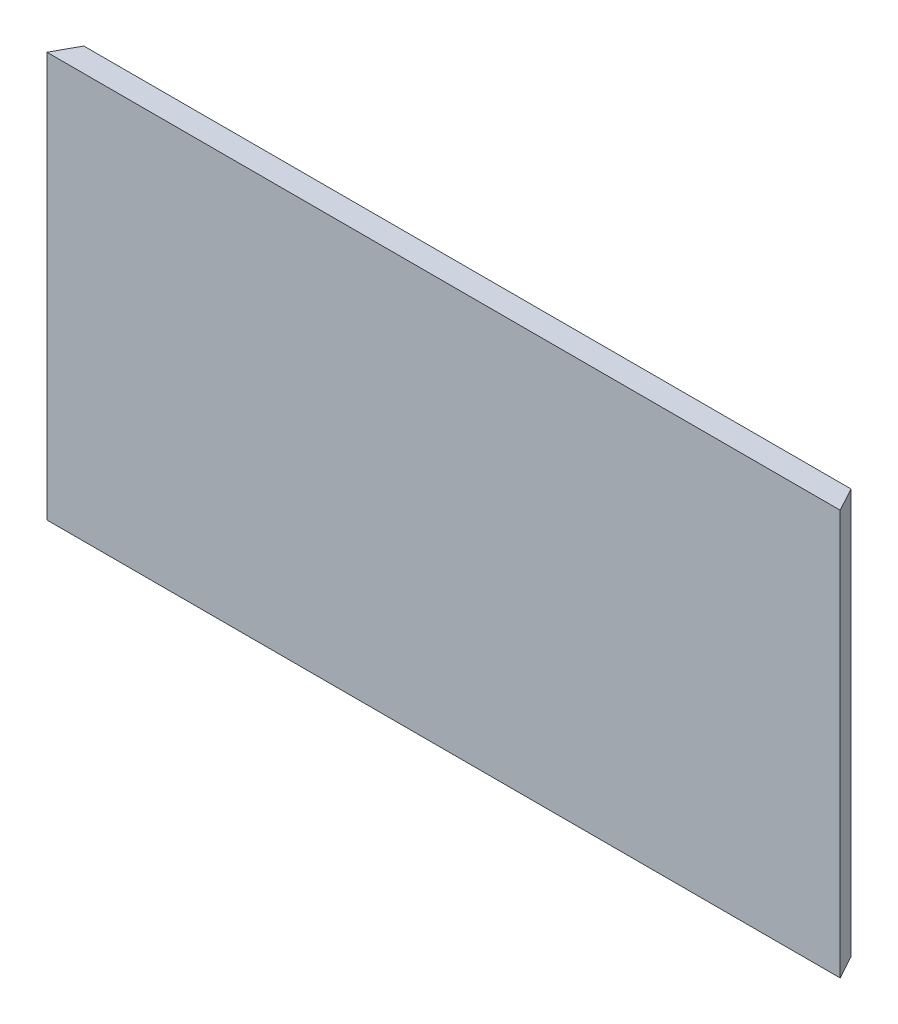
ISO-10303-21;
HEADER;
FILE_DESCRIPTION(('STEP AP214'),'2;1');
FILE_NAME('part.step','',(''),(''),'','','');
FILE_SCHEMA(('AUTOMOTIVE_DESIGN { 1 0 10303 214 1 1 1 1 }'));
ENDSEC;
DATA;
#1=APPLICATION_CONTEXT('core data for automotive mechanical design processes');
#2=APPLICATION_PROTOCOL_DEFINITION('international standard','automotive_design',2000,#1);
#3=PRODUCT_CONTEXT('',#1,'mechanical');
#4=PRODUCT('Part','Part','',(#3));
#5=PRODUCT_RELATED_PRODUCT_CATEGORY('part','',(#4));
#6=PRODUCT_DEFINITION_FORMATION('','',#4);
#7=PRODUCT_DEFINITION_CONTEXT('part definition',#1,'design');
#8=PRODUCT_DEFINITION('design','',#6,#7);
#9=PRODUCT_DEFINITION_SHAPE('','',#8);
#10=(LENGTH_UNIT() NAMED_UNIT(*) SI_UNIT(.MILLI.,.METRE.));
#11=(NAMED_UNIT(*) PLANE_ANGLE_UNIT() SI_UNIT($,.RADIAN.));
#12=(NAMED_UNIT(*) SI_UNIT($,.STERADIAN.) SOLID_ANGLE_UNIT());
#13=UNCERTAINTY_MEASURE_WITH_UNIT(LENGTH_MEASURE(1.E-05),#10,'distance_accuracy_value','');
#14=(GEOMETRIC_REPRESENTATION_CONTEXT(3) GLOBAL_UNCERTAINTY_ASSIGNED_CONTEXT((#13)) GLOBAL_UNIT_ASSIGNED_CONTEXT((#10,
#11,#12)) REPRESENTATION_CONTEXT('',''));
#15=CARTESIAN_POINT('',(0.,0.,0.));
#16=DIRECTION('',(0.,0.,1.));
#17=DIRECTION('',(1.,0.,0.));
#18=AXIS2_PLACEMENT_3D('',#15,#16,#17);
#19=CARTESIAN_POINT('',(0.,0.,-3.175));
#20=DIRECTION('',(0.,0.,-1.));
#21=DIRECTION('',(-1.,0.,0.));
#22=AXIS2_PLACEMENT_3D('',#19,#20,#21);
#23=PLANE('',#22);
#24=DIRECTION('',(0.,1.,0.));
#25=VECTOR('',#24,1.);
#26=CARTESIAN_POINT('',(-103.951667697434,53.975,-3.17499999999998));
#27=LINE('',#26,#25);
#28=CARTESIAN_POINT('',(-103.951667697434,0.,-3.17499999999998));
#29=VERTEX_POINT('',#28);
#30=CARTESIAN_POINT('',(-103.951667697434,53.975,-3.17499999999999));
#31=VERTEX_POINT('',#30);
#32=EDGE_CURVE('E80',#29,#31,#27,.T.);
#33=ORIENTED_EDGE('',*,*,#32,.T.);
#34=DIRECTION('',(1.,0.,0.));
#35=VECTOR('',#34,1.);
#36=CARTESIAN_POINT('',(-52.8425313988,53.975,-3.175));
#37=LINE('',#36,#35);
#38=CARTESIAN_POINT('',(-1.73339510016609,53.975,-3.175));
#39=VERTEX_POINT('',#38);
#40=EDGE_CURVE('E61',#39,#31,#37,.F.);
#41=ORIENTED_EDGE('',*,*,#40,.F.);
#42=DIRECTION('',(0.,1.,0.));
#43=VECTOR('',#42,1.);
#44=CARTESIAN_POINT('',(-1.73339510016609,53.975,-3.175));
#45=LINE('',#44,#43);
#46=CARTESIAN_POINT('',(-1.73339510016608,0.,-3.17499999999999));
#47=VERTEX_POINT('',#46);
#48=EDGE_CURVE('E56',#39,#47,#45,.F.);
#49=ORIENTED_EDGE('',*,*,#48,.T.);
#50=DIRECTION('',(1.,0.,0.));
#51=VECTOR('',#50,1.);
#52=CARTESIAN_POINT('',(-52.8425313988,0.,-3.17499999999997));
#53=LINE('',#52,#51);
#54=EDGE_CURVE('E20',#29,#47,#53,.T.);
#55=ORIENTED_EDGE('',*,*,#54,.F.);
#56=EDGE_LOOP('',(#33,#41,#49,#55));
#57=FACE_BOUND('',#56,.T.);
#58=ADVANCED_FACE('F17',(#57),#23,.T.);
#59=CARTESIAN_POINT('',(-52.8425313988,0.,-1.5875));
#60=DIRECTION('',(0.,-1.,0.));
#61=DIRECTION('',(0.,0.,-1.));
#62=AXIS2_PLACEMENT_3D('',#59,#60,#61);
#63=PLANE('',#62);
#64=DIRECTION('',(0.479188067823106,0.,-0.877712251057235));
#65=VECTOR('',#64,1.);
#66=CARTESIAN_POINT('',(-103.951667697434,0.,-3.175));
#67=LINE('',#66,#65);
#68=CARTESIAN_POINT('',(-105.6850627976,0.,0.));
#69=VERTEX_POINT('',#68);
#70=EDGE_CURVE('E68',#69,#29,#67,.T.);
#71=ORIENTED_EDGE('',*,*,#70,.T.);
#72=ORIENTED_EDGE('',*,*,#54,.T.);
#73=DIRECTION('',(0.479188067823105,0.,0.877712251057235));
#74=VECTOR('',#73,1.);
#75=CARTESIAN_POINT('',(0.,0.,0.));
#76=LINE('',#75,#74);
#77=CARTESIAN_POINT('',(0.,0.,0.));
#78=VERTEX_POINT('',#77);
#79=EDGE_CURVE('E63',#47,#78,#76,.T.);
#80=ORIENTED_EDGE('',*,*,#79,.T.);
#81=DIRECTION('',(1.,0.,0.));
#82=VECTOR('',#81,1.);
#83=CARTESIAN_POINT('',(-105.6850627976,0.,0.));
#84=LINE('',#83,#82);
#85=EDGE_CURVE('E83',#69,#78,#84,.T.);
#86=ORIENTED_EDGE('',*,*,#85,.F.);
#87=EDGE_LOOP('',(#71,#72,#80,#86));
#88=FACE_BOUND('',#87,.T.);
#89=ADVANCED_FACE('F65',(#88),#63,.T.);
#90=CARTESIAN_POINT('',(0.,53.975,0.));
#91=DIRECTION('',(-0.877712251057235,0.,0.479188067823105));
#92=DIRECTION('',(0.479188067823105,0.,0.877712251057235));
#93=AXIS2_PLACEMENT_3D('',#90,#91,#92);
#94=PLANE('',#93);
#95=DIRECTION('',(0.,1.,0.));
#96=VECTOR('',#95,1.);
#97=CARTESIAN_POINT('',(0.,0.,0.));
#98=LINE('',#97,#96);
#99=CARTESIAN_POINT('',(0.,53.975,0.));
#100=VERTEX_POINT('',#99);
#101=EDGE_CURVE('E72',#78,#100,#98,.T.);
#102=ORIENTED_EDGE('',*,*,#101,.F.);
#103=ORIENTED_EDGE('',*,*,#79,.F.);
#104=ORIENTED_EDGE('',*,*,#48,.F.);
#105=DIRECTION('',(-0.479188067823105,0.,-0.877712251057235));
#106=VECTOR('',#105,1.);
#107=CARTESIAN_POINT('',(0.,53.975,0.));
#108=LINE('',#107,#106);
#109=EDGE_CURVE('E74',#100,#39,#108,.T.);
#110=ORIENTED_EDGE('',*,*,#109,.F.);
#111=EDGE_LOOP('',(#102,#103,#104,#110));
#112=FACE_BOUND('',#111,.T.);
#113=ADVANCED_FACE('F70',(#112),#94,.F.);
#114=CARTESIAN_POINT('',(-52.8425313988,53.975,-1.5875));
#115=DIRECTION('',(0.,1.,0.));
#116=DIRECTION('',(0.,0.,1.));
#117=AXIS2_PLACEMENT_3D('',#114,#115,#116);
#118=PLANE('',#117);
#119=DIRECTION('',(0.479188067823106,0.,-0.877712251057235));
#120=VECTOR('',#119,1.);
#121=CARTESIAN_POINT('',(-103.951667697434,53.975,-3.175));
#122=LINE('',#121,#120);
#123=CARTESIAN_POINT('',(-105.6850627976,53.975,0.));
#124=VERTEX_POINT('',#123);
#125=EDGE_CURVE('E35',#31,#124,#122,.F.);
#126=ORIENTED_EDGE('',*,*,#125,.T.);
#127=DIRECTION('',(1.,0.,0.));
#128=VECTOR('',#127,1.);
#129=CARTESIAN_POINT('',(-105.6850627976,53.975,0.));
#130=LINE('',#129,#128);
#131=EDGE_CURVE('E26',#100,#124,#130,.F.);
#132=ORIENTED_EDGE('',*,*,#131,.F.);
#133=ORIENTED_EDGE('',*,*,#109,.T.);
#134=ORIENTED_EDGE('',*,*,#40,.T.);
#135=EDGE_LOOP('',(#126,#132,#133,#134));
#136=FACE_BOUND('',#135,.T.);
#137=ADVANCED_FACE('F89',(#136),#118,.T.);
#138=CARTESIAN_POINT('',(-103.951667697434,53.975,-3.175));
#139=DIRECTION('',(0.877712251057235,0.,0.479188067823106));
#140=DIRECTION('',(0.479188067823106,0.,-0.877712251057235));
#141=AXIS2_PLACEMENT_3D('',#138,#139,#140);
#142=PLANE('',#141);
#143=ORIENTED_EDGE('',*,*,#32,.F.);
#144=ORIENTED_EDGE('',*,*,#70,.F.);
#145=DIRECTION('',(0.,1.,0.));
#146=VECTOR('',#145,1.);
#147=CARTESIAN_POINT('',(-105.6850627976,0.,0.));
#148=LINE('',#147,#146);
#149=EDGE_CURVE('E11',#124,#69,#148,.F.);
#150=ORIENTED_EDGE('',*,*,#149,.F.);
#151=ORIENTED_EDGE('',*,*,#125,.F.);
#152=EDGE_LOOP('',(#143,#144,#150,#151));
#153=FACE_BOUND('',#152,.T.);
#154=ADVANCED_FACE('F91',(#153),#142,.F.);
#155=CARTESIAN_POINT('',(-105.6850627976,0.,0.));
#156=DIRECTION('',(0.,0.,1.));
#157=DIRECTION('',(1.,0.,0.));
#158=AXIS2_PLACEMENT_3D('',#155,#156,#157);
#159=PLANE('',#158);
#160=ORIENTED_EDGE('',*,*,#131,.T.);
#161=ORIENTED_EDGE('',*,*,#149,.T.);
#162=ORIENTED_EDGE('',*,*,#85,.T.);
#163=ORIENTED_EDGE('',*,*,#101,.T.);
#164=EDGE_LOOP('',(#160,#161,#162,#163));
#165=FACE_BOUND('',#164,.T.);
#166=ADVANCED_FACE('F88',(#165),#159,.T.);
#167=CLOSED_SHELL('',(#58,#89,#113,#137,#154,#166));
#168=MANIFOLD_SOLID_BREP('B1',#167);
#169=ADVANCED_BREP_SHAPE_REPRESENTATION('',(#18,#168),#14);
#170=SHAPE_DEFINITION_REPRESENTATION(#9,#169);
ENDSEC;
END-ISO-10303-21;
